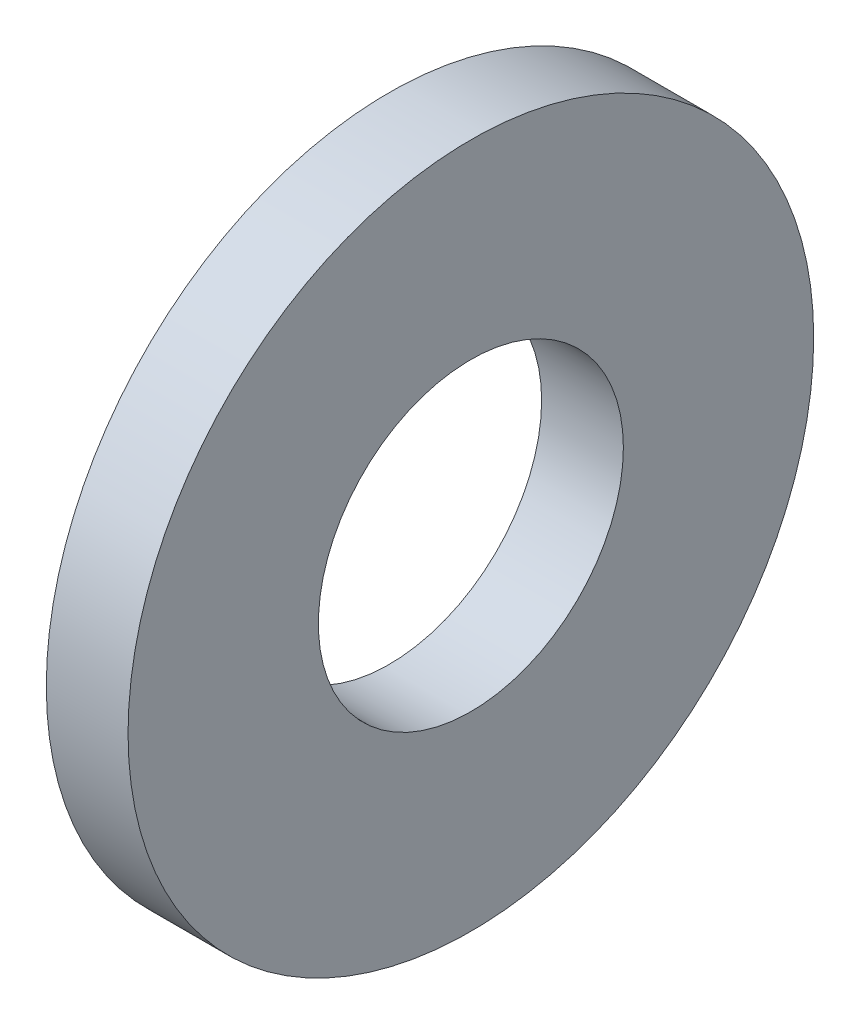
ISO-10303-21;
HEADER;
FILE_DESCRIPTION(('STEP AP214'),'2;1');
FILE_NAME('part.step','',(''),(''),'','','');
FILE_SCHEMA(('AUTOMOTIVE_DESIGN { 1 0 10303 214 1 1 1 1 }'));
ENDSEC;
DATA;
#1=APPLICATION_CONTEXT('core data for automotive mechanical design processes');
#2=APPLICATION_PROTOCOL_DEFINITION('international standard','automotive_design',2000,#1);
#3=PRODUCT_CONTEXT('',#1,'mechanical');
#4=PRODUCT('Part','Part','',(#3));
#5=PRODUCT_RELATED_PRODUCT_CATEGORY('part','',(#4));
#6=PRODUCT_DEFINITION_FORMATION('','',#4);
#7=PRODUCT_DEFINITION_CONTEXT('part definition',#1,'design');
#8=PRODUCT_DEFINITION('design','',#6,#7);
#9=PRODUCT_DEFINITION_SHAPE('','',#8);
#10=(LENGTH_UNIT() NAMED_UNIT(*) SI_UNIT(.MILLI.,.METRE.));
#11=(NAMED_UNIT(*) PLANE_ANGLE_UNIT() SI_UNIT($,.RADIAN.));
#12=(NAMED_UNIT(*) SI_UNIT($,.STERADIAN.) SOLID_ANGLE_UNIT());
#13=UNCERTAINTY_MEASURE_WITH_UNIT(LENGTH_MEASURE(1.E-05),#10,'distance_accuracy_value','');
#14=(GEOMETRIC_REPRESENTATION_CONTEXT(3) GLOBAL_UNCERTAINTY_ASSIGNED_CONTEXT((#13)) GLOBAL_UNIT_ASSIGNED_CONTEXT((#10,
#11,#12)) REPRESENTATION_CONTEXT('',''));
#15=CARTESIAN_POINT('',(0.,0.,0.));
#16=DIRECTION('',(0.,0.,1.));
#17=DIRECTION('',(1.,0.,0.));
#18=AXIS2_PLACEMENT_3D('',#15,#16,#17);
#19=CARTESIAN_POINT('',(1.7018,0.,0.));
#20=DIRECTION('',(1.,0.,0.));
#21=DIRECTION('',(0.,0.,-1.));
#22=AXIS2_PLACEMENT_3D('',#19,#20,#21);
#23=PLANE('',#22);
#24=CARTESIAN_POINT('',(1.7018,0.,0.));
#25=DIRECTION('',(1.,0.,0.));
#26=DIRECTION('',(0.,0.,-1.));
#27=AXIS2_PLACEMENT_3D('',#24,#25,#26);
#28=CIRCLE('',#27,7.1374);
#29=CARTESIAN_POINT('',(1.7018,0.,-7.1374));
#30=VERTEX_POINT('',#29);
#31=EDGE_CURVE('E10',#30,#30,#28,.T.);
#32=ORIENTED_EDGE('',*,*,#31,.T.);
#33=EDGE_LOOP('',(#32));
#34=FACE_BOUND('',#33,.T.);
#35=CARTESIAN_POINT('',(1.7018,0.,0.));
#36=DIRECTION('',(1.,0.,0.));
#37=DIRECTION('',(0.,0.,-1.));
#38=AXIS2_PLACEMENT_3D('',#35,#36,#37);
#39=CIRCLE('',#38,3.175);
#40=CARTESIAN_POINT('',(1.7018,0.,-3.175));
#41=VERTEX_POINT('',#40);
#42=EDGE_CURVE('E39',#41,#41,#39,.T.);
#43=ORIENTED_EDGE('',*,*,#42,.F.);
#44=EDGE_LOOP('',(#43));
#45=FACE_BOUND('',#44,.T.);
#46=ADVANCED_FACE('F28',(#34,#45),#23,.T.);
#47=CARTESIAN_POINT('',(0.,0.,0.));
#48=DIRECTION('',(1.,0.,0.));
#49=DIRECTION('',(0.,0.,-1.));
#50=AXIS2_PLACEMENT_3D('',#47,#48,#49);
#51=PLANE('',#50);
#52=CARTESIAN_POINT('',(0.,0.,0.));
#53=DIRECTION('',(1.,0.,0.));
#54=DIRECTION('',(0.,0.,-1.));
#55=AXIS2_PLACEMENT_3D('',#52,#53,#54);
#56=CIRCLE('',#55,7.1374);
#57=CARTESIAN_POINT('',(0.,0.,-7.1374));
#58=VERTEX_POINT('',#57);
#59=EDGE_CURVE('E32',#58,#58,#56,.T.);
#60=ORIENTED_EDGE('',*,*,#59,.F.);
#61=EDGE_LOOP('',(#60));
#62=FACE_BOUND('',#61,.T.);
#63=CARTESIAN_POINT('',(0.,0.,0.));
#64=DIRECTION('',(1.,0.,0.));
#65=DIRECTION('',(0.,0.,-1.));
#66=AXIS2_PLACEMENT_3D('',#63,#64,#65);
#67=CIRCLE('',#66,3.175);
#68=CARTESIAN_POINT('',(0.,0.,-3.175));
#69=VERTEX_POINT('',#68);
#70=EDGE_CURVE('E41',#69,#69,#67,.T.);
#71=ORIENTED_EDGE('',*,*,#70,.T.);
#72=EDGE_LOOP('',(#71));
#73=FACE_BOUND('',#72,.T.);
#74=ADVANCED_FACE('F51',(#62,#73),#51,.F.);
#75=CARTESIAN_POINT('',(1.7018,0.,0.));
#76=DIRECTION('',(-1.,0.,0.));
#77=DIRECTION('',(0.,0.,1.));
#78=AXIS2_PLACEMENT_3D('',#75,#76,#77);
#79=CYLINDRICAL_SURFACE('',#78,7.1374);
#80=ORIENTED_EDGE('',*,*,#31,.F.);
#81=EDGE_LOOP('',(#80));
#82=FACE_BOUND('',#81,.T.);
#83=ORIENTED_EDGE('',*,*,#59,.T.);
#84=EDGE_LOOP('',(#83));
#85=FACE_BOUND('',#84,.T.);
#86=ADVANCED_FACE('F30',(#82,#85),#79,.T.);
#87=CARTESIAN_POINT('',(1.7018,0.,0.));
#88=DIRECTION('',(-1.,0.,0.));
#89=DIRECTION('',(0.,0.,1.));
#90=AXIS2_PLACEMENT_3D('',#87,#88,#89);
#91=CYLINDRICAL_SURFACE('',#90,3.175);
#92=ORIENTED_EDGE('',*,*,#42,.T.);
#93=EDGE_LOOP('',(#92));
#94=FACE_BOUND('',#93,.T.);
#95=ORIENTED_EDGE('',*,*,#70,.F.);
#96=EDGE_LOOP('',(#95));
#97=FACE_BOUND('',#96,.T.);
#98=ADVANCED_FACE('F47',(#94,#97),#91,.F.);
#99=CLOSED_SHELL('',(#46,#74,#86,#98));
#100=MANIFOLD_SOLID_BREP('B2',#99);
#101=ADVANCED_BREP_SHAPE_REPRESENTATION('',(#18,#100),#14);
#102=SHAPE_DEFINITION_REPRESENTATION(#9,#101);
ENDSEC;
END-ISO-10303-21;
